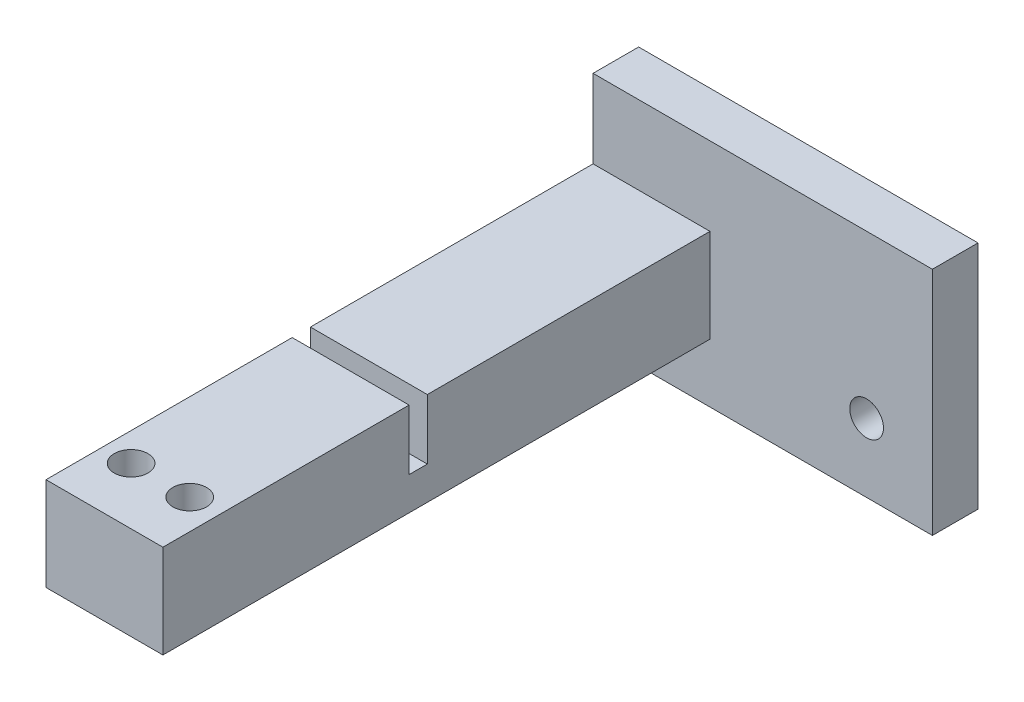
ISO-10303-21;
HEADER;
FILE_DESCRIPTION(('STEP AP214'),'2;1');
FILE_NAME('part.step','',(''),(''),'','','');
FILE_SCHEMA(('AUTOMOTIVE_DESIGN { 1 0 10303 214 1 1 1 1 }'));
ENDSEC;
DATA;
#1=APPLICATION_CONTEXT('core data for automotive mechanical design processes');
#2=APPLICATION_PROTOCOL_DEFINITION('international standard','automotive_design',2000,#1);
#3=PRODUCT_CONTEXT('',#1,'mechanical');
#4=PRODUCT('Part','Part','',(#3));
#5=PRODUCT_RELATED_PRODUCT_CATEGORY('part','',(#4));
#6=PRODUCT_DEFINITION_FORMATION('','',#4);
#7=PRODUCT_DEFINITION_CONTEXT('part definition',#1,'design');
#8=PRODUCT_DEFINITION('design','',#6,#7);
#9=PRODUCT_DEFINITION_SHAPE('','',#8);
#10=(LENGTH_UNIT() NAMED_UNIT(*) SI_UNIT(.MILLI.,.METRE.));
#11=(NAMED_UNIT(*) PLANE_ANGLE_UNIT() SI_UNIT($,.RADIAN.));
#12=(NAMED_UNIT(*) SI_UNIT($,.STERADIAN.) SOLID_ANGLE_UNIT());
#13=UNCERTAINTY_MEASURE_WITH_UNIT(LENGTH_MEASURE(1.E-05),#10,'distance_accuracy_value','');
#14=(GEOMETRIC_REPRESENTATION_CONTEXT(3) GLOBAL_UNCERTAINTY_ASSIGNED_CONTEXT((#13)) GLOBAL_UNIT_ASSIGNED_CONTEXT((#10,
#11,#12)) REPRESENTATION_CONTEXT('',''));
#15=CARTESIAN_POINT('',(0.,0.,0.));
#16=DIRECTION('',(0.,0.,1.));
#17=DIRECTION('',(1.,0.,0.));
#18=AXIS2_PLACEMENT_3D('',#15,#16,#17);
#19=CARTESIAN_POINT('',(-7.63393751811079,-236.230646054278,65.));
#20=DIRECTION('',(0.,-1.,0.));
#21=DIRECTION('',(0.,0.,-1.));
#22=AXIS2_PLACEMENT_3D('',#19,#20,#21);
#23=PLANE('',#22);
#24=CARTESIAN_POINT('',(1.90549840476706,-236.230646054278,58.7782407464542));
#25=DIRECTION('',(0.,1.,0.));
#26=DIRECTION('',(0.,0.,1.));
#27=AXIS2_PLACEMENT_3D('',#24,#25,#26);
#28=CIRCLE('',#27,1.85);
#29=CARTESIAN_POINT('',(1.90549840476706,-236.230646054278,60.6282407464542));
#30=VERTEX_POINT('',#29);
#31=EDGE_CURVE('E216',#30,#30,#28,.T.);
#32=ORIENTED_EDGE('',*,*,#31,.F.);
#33=EDGE_LOOP('',(#32));
#34=FACE_BOUND('',#33,.T.);
#35=CARTESIAN_POINT('',(-4.52306634815614,-236.230646054278,58.7782407464542));
#36=DIRECTION('',(0.,1.,0.));
#37=DIRECTION('',(0.,0.,1.));
#38=AXIS2_PLACEMENT_3D('',#35,#36,#37);
#39=CIRCLE('',#38,1.85);
#40=CARTESIAN_POINT('',(-4.52306634815614,-236.230646054278,60.6282407464542));
#41=VERTEX_POINT('',#40);
#42=EDGE_CURVE('E222',#41,#41,#39,.T.);
#43=ORIENTED_EDGE('',*,*,#42,.F.);
#44=EDGE_LOOP('',(#43));
#45=FACE_BOUND('',#44,.T.);
#46=DIRECTION('',(0.,0.,-1.));
#47=VECTOR('',#46,1.);
#48=CARTESIAN_POINT('',(5.18885462118252,-236.230646054278,65.));
#49=LINE('',#48,#47);
#50=CARTESIAN_POINT('',(5.18885462118252,-236.230646054278,65.));
#51=VERTEX_POINT('',#50);
#52=CARTESIAN_POINT('',(5.18885462118252,-236.230646054278,38.0000000000003));
#53=VERTEX_POINT('',#52);
#54=EDGE_CURVE('E172',#51,#53,#49,.T.);
#55=ORIENTED_EDGE('',*,*,#54,.T.);
#56=DIRECTION('',(-1.,0.,0.));
#57=VECTOR('',#56,1.);
#58=CARTESIAN_POINT('',(-7.63393751811079,-236.230646054278,38.0000000000003));
#59=LINE('',#58,#57);
#60=CARTESIAN_POINT('',(-7.63393751811079,-236.230646054278,38.0000000000003));
#61=VERTEX_POINT('',#60);
#62=EDGE_CURVE('E43',#53,#61,#59,.T.);
#63=ORIENTED_EDGE('',*,*,#62,.T.);
#64=DIRECTION('',(0.,0.,-1.));
#65=VECTOR('',#64,1.);
#66=CARTESIAN_POINT('',(-7.63393751811079,-236.230646054278,65.));
#67=LINE('',#66,#65);
#68=CARTESIAN_POINT('',(-7.63393751811079,-236.230646054278,65.));
#69=VERTEX_POINT('',#68);
#70=EDGE_CURVE('E170',#69,#61,#67,.T.);
#71=ORIENTED_EDGE('',*,*,#70,.F.);
#72=DIRECTION('',(-1.,0.,0.));
#73=VECTOR('',#72,1.);
#74=CARTESIAN_POINT('',(-7.63393751811079,-236.230646054278,65.));
#75=LINE('',#74,#73);
#76=EDGE_CURVE('E161',#51,#69,#75,.T.);
#77=ORIENTED_EDGE('',*,*,#76,.F.);
#78=EDGE_LOOP('',(#55,#63,#71,#77));
#79=FACE_BOUND('',#78,.T.);
#80=ADVANCED_FACE('F34',(#34,#45,#79),#23,.F.);
#81=CARTESIAN_POINT('',(-7.63393751811079,-227.630923277245,5.));
#82=DIRECTION('',(1.,0.,0.));
#83=DIRECTION('',(0.,1.,0.));
#84=AXIS2_PLACEMENT_3D('',#81,#82,#83);
#85=PLANE('',#84);
#86=ORIENTED_EDGE('',*,*,#70,.T.);
#87=DIRECTION('',(0.,1.,0.));
#88=VECTOR('',#87,1.);
#89=CARTESIAN_POINT('',(-7.63393751811079,-236.05692623174,38.0000000000003));
#90=LINE('',#89,#88);
#91=CARTESIAN_POINT('',(-7.63393751811079,-242.835145352554,38.0000000000003));
#92=VERTEX_POINT('',#91);
#93=EDGE_CURVE('E141',#92,#61,#90,.T.);
#94=ORIENTED_EDGE('',*,*,#93,.F.);
#95=DIRECTION('',(0.,0.,1.));
#96=VECTOR('',#95,1.);
#97=CARTESIAN_POINT('',(-7.63393751811079,-242.835145352554,38.0000000000003));
#98=LINE('',#97,#96);
#99=CARTESIAN_POINT('',(-7.63393751811079,-242.835145352554,36.0000000000003));
#100=VERTEX_POINT('',#99);
#101=EDGE_CURVE('E131',#100,#92,#98,.T.);
#102=ORIENTED_EDGE('',*,*,#101,.F.);
#103=DIRECTION('',(0.,-1.,0.));
#104=VECTOR('',#103,1.);
#105=CARTESIAN_POINT('',(-7.63393751811079,-236.05692623174,36.0000000000003));
#106=LINE('',#105,#104);
#107=CARTESIAN_POINT('',(-7.63393751811079,-236.230646054278,36.0000000000003));
#108=VERTEX_POINT('',#107);
#109=EDGE_CURVE('E136',#108,#100,#106,.T.);
#110=ORIENTED_EDGE('',*,*,#109,.F.);
#111=CARTESIAN_POINT('',(-7.63393751811079,-236.230646054278,5.));
#112=VERTEX_POINT('',#111);
#113=EDGE_CURVE('E163',#108,#112,#67,.T.);
#114=ORIENTED_EDGE('',*,*,#113,.T.);
#115=DIRECTION('',(0.,-1.,0.));
#116=VECTOR('',#115,1.);
#117=CARTESIAN_POINT('',(-7.63393751811079,-227.630923277245,5.));
#118=LINE('',#117,#116);
#119=CARTESIAN_POINT('',(-7.63393751811079,-227.630923277245,5.));
#120=VERTEX_POINT('',#119);
#121=EDGE_CURVE('E182',#120,#112,#118,.T.);
#122=ORIENTED_EDGE('',*,*,#121,.F.);
#123=DIRECTION('',(0.,0.,-1.));
#124=VECTOR('',#123,1.);
#125=CARTESIAN_POINT('',(-7.63393751811079,-227.630923277245,5.));
#126=LINE('',#125,#124);
#127=CARTESIAN_POINT('',(-7.63393751811079,-227.630923277245,0.));
#128=VERTEX_POINT('',#127);
#129=EDGE_CURVE('E192',#120,#128,#126,.T.);
#130=ORIENTED_EDGE('',*,*,#129,.T.);
#131=DIRECTION('',(0.,-1.,0.));
#132=VECTOR('',#131,1.);
#133=CARTESIAN_POINT('',(-7.63393751811079,-227.630923277245,0.));
#134=LINE('',#133,#132);
#135=CARTESIAN_POINT('',(-7.63393751811079,-252.920569029994,0.));
#136=VERTEX_POINT('',#135);
#137=EDGE_CURVE('E181',#128,#136,#134,.T.);
#138=ORIENTED_EDGE('',*,*,#137,.T.);
#139=DIRECTION('',(0.,0.,-1.));
#140=VECTOR('',#139,1.);
#141=CARTESIAN_POINT('',(-7.63393751811079,-252.920569029994,5.));
#142=LINE('',#141,#140);
#143=CARTESIAN_POINT('',(-7.63393751811079,-252.920569029994,5.));
#144=VERTEX_POINT('',#143);
#145=EDGE_CURVE('E209',#144,#136,#142,.T.);
#146=ORIENTED_EDGE('',*,*,#145,.F.);
#147=CARTESIAN_POINT('',(-7.63393751811079,-246.472515965401,5.));
#148=VERTEX_POINT('',#147);
#149=EDGE_CURVE('E186',#148,#144,#118,.T.);
#150=ORIENTED_EDGE('',*,*,#149,.F.);
#151=DIRECTION('',(0.,0.,-1.));
#152=VECTOR('',#151,1.);
#153=CARTESIAN_POINT('',(-7.63393751811079,-246.472515965401,65.));
#154=LINE('',#153,#152);
#155=CARTESIAN_POINT('',(-7.63393751811079,-246.472515965401,65.));
#156=VERTEX_POINT('',#155);
#157=EDGE_CURVE('E178',#156,#148,#154,.T.);
#158=ORIENTED_EDGE('',*,*,#157,.F.);
#159=DIRECTION('',(0.,-1.,0.));
#160=VECTOR('',#159,1.);
#161=CARTESIAN_POINT('',(-7.63393751811079,-236.230646054278,65.));
#162=LINE('',#161,#160);
#163=EDGE_CURVE('E153',#69,#156,#162,.T.);
#164=ORIENTED_EDGE('',*,*,#163,.F.);
#165=EDGE_LOOP('',(#86,#94,#102,#110,#114,#122,#130,#138,#146,#150,#158,#164));
#166=FACE_BOUND('',#165,.T.);
#167=ADVANCED_FACE('F36',(#166),#85,.F.);
#168=CARTESIAN_POINT('',(-7.63393751811079,-252.920569029994,5.));
#169=DIRECTION('',(0.,1.,0.));
#170=DIRECTION('',(0.,0.,1.));
#171=AXIS2_PLACEMENT_3D('',#168,#169,#170);
#172=PLANE('',#171);
#173=DIRECTION('',(1.,0.,0.));
#174=VECTOR('',#173,1.);
#175=CARTESIAN_POINT('',(-7.63393751811079,-252.920569029994,0.));
#176=LINE('',#175,#174);
#177=CARTESIAN_POINT('',(29.5856691067899,-252.920569029994,0.));
#178=VERTEX_POINT('',#177);
#179=EDGE_CURVE('E195',#136,#178,#176,.T.);
#180=ORIENTED_EDGE('',*,*,#179,.T.);
#181=DIRECTION('',(0.,0.,-1.));
#182=VECTOR('',#181,1.);
#183=CARTESIAN_POINT('',(29.5856691067899,-252.920569029994,5.));
#184=LINE('',#183,#182);
#185=CARTESIAN_POINT('',(29.5856691067899,-252.920569029994,5.));
#186=VERTEX_POINT('',#185);
#187=EDGE_CURVE('E206',#186,#178,#184,.T.);
#188=ORIENTED_EDGE('',*,*,#187,.F.);
#189=DIRECTION('',(1.,0.,0.));
#190=VECTOR('',#189,1.);
#191=CARTESIAN_POINT('',(-7.63393751811079,-252.920569029994,5.));
#192=LINE('',#191,#190);
#193=EDGE_CURVE('E185',#144,#186,#192,.T.);
#194=ORIENTED_EDGE('',*,*,#193,.F.);
#195=ORIENTED_EDGE('',*,*,#145,.T.);
#196=EDGE_LOOP('',(#180,#188,#194,#195));
#197=FACE_BOUND('',#196,.T.);
#198=ADVANCED_FACE('F277',(#197),#172,.F.);
#199=CARTESIAN_POINT('',(29.5856691067899,-227.630923277245,5.));
#200=DIRECTION('',(-1.,0.,0.));
#201=DIRECTION('',(0.,-1.,0.));
#202=AXIS2_PLACEMENT_3D('',#199,#200,#201);
#203=PLANE('',#202);
#204=DIRECTION('',(0.,1.,0.));
#205=VECTOR('',#204,1.);
#206=CARTESIAN_POINT('',(29.5856691067899,-227.630923277245,0.));
#207=LINE('',#206,#205);
#208=CARTESIAN_POINT('',(29.5856691067899,-227.630923277245,0.));
#209=VERTEX_POINT('',#208);
#210=EDGE_CURVE('E197',#178,#209,#207,.T.);
#211=ORIENTED_EDGE('',*,*,#210,.T.);
#212=DIRECTION('',(0.,0.,-1.));
#213=VECTOR('',#212,1.);
#214=CARTESIAN_POINT('',(29.5856691067899,-227.630923277245,5.));
#215=LINE('',#214,#213);
#216=CARTESIAN_POINT('',(29.5856691067899,-227.630923277245,5.));
#217=VERTEX_POINT('',#216);
#218=EDGE_CURVE('E203',#217,#209,#215,.T.);
#219=ORIENTED_EDGE('',*,*,#218,.F.);
#220=DIRECTION('',(0.,1.,0.));
#221=VECTOR('',#220,1.);
#222=CARTESIAN_POINT('',(29.5856691067899,-227.630923277245,5.));
#223=LINE('',#222,#221);
#224=EDGE_CURVE('E188',#186,#217,#223,.T.);
#225=ORIENTED_EDGE('',*,*,#224,.F.);
#226=ORIENTED_EDGE('',*,*,#187,.T.);
#227=EDGE_LOOP('',(#211,#219,#225,#226));
#228=FACE_BOUND('',#227,.T.);
#229=ADVANCED_FACE('F300',(#228),#203,.F.);
#230=CARTESIAN_POINT('',(-7.63393751811079,-227.630923277245,5.));
#231=DIRECTION('',(0.,-1.,0.));
#232=DIRECTION('',(0.,0.,-1.));
#233=AXIS2_PLACEMENT_3D('',#230,#231,#232);
#234=PLANE('',#233);
#235=DIRECTION('',(-1.,0.,0.));
#236=VECTOR('',#235,1.);
#237=CARTESIAN_POINT('',(-7.63393751811079,-227.630923277245,0.));
#238=LINE('',#237,#236);
#239=EDGE_CURVE('E199',#209,#128,#238,.T.);
#240=ORIENTED_EDGE('',*,*,#239,.T.);
#241=ORIENTED_EDGE('',*,*,#129,.F.);
#242=DIRECTION('',(-1.,0.,0.));
#243=VECTOR('',#242,1.);
#244=CARTESIAN_POINT('',(-7.63393751811079,-227.630923277245,5.));
#245=LINE('',#244,#243);
#246=EDGE_CURVE('E190',#217,#120,#245,.T.);
#247=ORIENTED_EDGE('',*,*,#246,.F.);
#248=ORIENTED_EDGE('',*,*,#218,.T.);
#249=EDGE_LOOP('',(#240,#241,#247,#248));
#250=FACE_BOUND('',#249,.T.);
#251=ADVANCED_FACE('F290',(#250),#234,.F.);
#252=CARTESIAN_POINT('',(0.,0.,5.));
#253=DIRECTION('',(0.,0.,1.));
#254=DIRECTION('',(1.,0.,0.));
#255=AXIS2_PLACEMENT_3D('',#252,#253,#254);
#256=PLANE('',#255);
#257=CARTESIAN_POINT('',(-2.79517748901244,-249.862416258245,5.));
#258=DIRECTION('',(0.,0.,1.));
#259=DIRECTION('',(1.,0.,0.));
#260=AXIS2_PLACEMENT_3D('',#257,#258,#259);
#261=CIRCLE('',#260,1.85);
#262=CARTESIAN_POINT('',(-0.945177489012438,-249.862416258245,5.));
#263=VERTEX_POINT('',#262);
#264=EDGE_CURVE('E229',#263,#263,#261,.T.);
#265=ORIENTED_EDGE('',*,*,#264,.F.);
#266=EDGE_LOOP('',(#265));
#267=FACE_BOUND('',#266,.T.);
#268=CARTESIAN_POINT('',(22.3691525775393,-245.4020720401,5.));
#269=DIRECTION('',(0.,0.,1.));
#270=DIRECTION('',(1.,0.,0.));
#271=AXIS2_PLACEMENT_3D('',#268,#269,#270);
#272=CIRCLE('',#271,1.85);
#273=CARTESIAN_POINT('',(24.2191525775393,-245.4020720401,5.));
#274=VERTEX_POINT('',#273);
#275=EDGE_CURVE('E220',#274,#274,#272,.T.);
#276=ORIENTED_EDGE('',*,*,#275,.F.);
#277=EDGE_LOOP('',(#276));
#278=FACE_BOUND('',#277,.T.);
#279=DIRECTION('',(-1.,0.,0.));
#280=VECTOR('',#279,1.);
#281=CARTESIAN_POINT('',(-7.63393751811079,-236.230646054278,5.));
#282=LINE('',#281,#280);
#283=CARTESIAN_POINT('',(5.18885462118252,-236.230646054278,5.));
#284=VERTEX_POINT('',#283);
#285=EDGE_CURVE('E157',#284,#112,#282,.T.);
#286=ORIENTED_EDGE('',*,*,#285,.F.);
#287=DIRECTION('',(0.,1.,0.));
#288=VECTOR('',#287,1.);
#289=CARTESIAN_POINT('',(5.18885462118252,-236.230646054278,5.));
#290=LINE('',#289,#288);
#291=CARTESIAN_POINT('',(5.18885462118252,-246.472515965401,5.));
#292=VERTEX_POINT('',#291);
#293=EDGE_CURVE('E166',#292,#284,#290,.T.);
#294=ORIENTED_EDGE('',*,*,#293,.F.);
#295=DIRECTION('',(1.,0.,0.));
#296=VECTOR('',#295,1.);
#297=CARTESIAN_POINT('',(-7.63393751811079,-246.472515965401,5.));
#298=LINE('',#297,#296);
#299=EDGE_CURVE('E152',#148,#292,#298,.T.);
#300=ORIENTED_EDGE('',*,*,#299,.F.);
#301=ORIENTED_EDGE('',*,*,#149,.T.);
#302=ORIENTED_EDGE('',*,*,#193,.T.);
#303=ORIENTED_EDGE('',*,*,#224,.T.);
#304=ORIENTED_EDGE('',*,*,#246,.T.);
#305=ORIENTED_EDGE('',*,*,#121,.T.);
#306=EDGE_LOOP('',(#286,#294,#300,#301,#302,#303,#304,#305));
#307=FACE_BOUND('',#306,.T.);
#308=ADVANCED_FACE('F255',(#267,#278,#307),#256,.T.);
#309=CARTESIAN_POINT('',(0.,0.,0.));
#310=DIRECTION('',(0.,0.,1.));
#311=DIRECTION('',(1.,0.,0.));
#312=AXIS2_PLACEMENT_3D('',#309,#310,#311);
#313=PLANE('',#312);
#314=CARTESIAN_POINT('',(-2.79517748901244,-249.862416258245,0.));
#315=DIRECTION('',(0.,0.,1.));
#316=DIRECTION('',(1.,0.,0.));
#317=AXIS2_PLACEMENT_3D('',#314,#315,#316);
#318=CIRCLE('',#317,1.85);
#319=CARTESIAN_POINT('',(-0.945177489012438,-249.862416258245,0.));
#320=VERTEX_POINT('',#319);
#321=EDGE_CURVE('E232',#320,#320,#318,.F.);
#322=ORIENTED_EDGE('',*,*,#321,.F.);
#323=EDGE_LOOP('',(#322));
#324=FACE_BOUND('',#323,.T.);
#325=CARTESIAN_POINT('',(22.3691525775393,-245.4020720401,0.));
#326=DIRECTION('',(0.,0.,1.));
#327=DIRECTION('',(1.,0.,0.));
#328=AXIS2_PLACEMENT_3D('',#325,#326,#327);
#329=CIRCLE('',#328,1.85);
#330=CARTESIAN_POINT('',(24.2191525775393,-245.4020720401,0.));
#331=VERTEX_POINT('',#330);
#332=EDGE_CURVE('E233',#331,#331,#329,.F.);
#333=ORIENTED_EDGE('',*,*,#332,.F.);
#334=EDGE_LOOP('',(#333));
#335=FACE_BOUND('',#334,.T.);
#336=ORIENTED_EDGE('',*,*,#137,.F.);
#337=ORIENTED_EDGE('',*,*,#239,.F.);
#338=ORIENTED_EDGE('',*,*,#210,.F.);
#339=ORIENTED_EDGE('',*,*,#179,.F.);
#340=EDGE_LOOP('',(#336,#337,#338,#339));
#341=FACE_BOUND('',#340,.T.);
#342=ADVANCED_FACE('F259',(#324,#335,#341),#313,.F.);
#343=CARTESIAN_POINT('',(-7.63393751811079,-246.472515965401,65.));
#344=DIRECTION('',(0.,1.,0.));
#345=DIRECTION('',(0.,0.,1.));
#346=AXIS2_PLACEMENT_3D('',#343,#344,#345);
#347=PLANE('',#346);
#348=CARTESIAN_POINT('',(1.90549840476706,-246.472515965401,58.7782407464542));
#349=DIRECTION('',(0.,1.,0.));
#350=DIRECTION('',(0.,0.,1.));
#351=AXIS2_PLACEMENT_3D('',#348,#349,#350);
#352=CIRCLE('',#351,1.85);
#353=CARTESIAN_POINT('',(1.90549840476706,-246.472515965401,60.6282407464542));
#354=VERTEX_POINT('',#353);
#355=EDGE_CURVE('E38',#354,#354,#352,.T.);
#356=ORIENTED_EDGE('',*,*,#355,.T.);
#357=EDGE_LOOP('',(#356));
#358=FACE_BOUND('',#357,.T.);
#359=CARTESIAN_POINT('',(-4.52306634815614,-246.472515965401,58.7782407464542));
#360=DIRECTION('',(0.,1.,0.));
#361=DIRECTION('',(0.,0.,1.));
#362=AXIS2_PLACEMENT_3D('',#359,#360,#361);
#363=CIRCLE('',#362,1.85);
#364=CARTESIAN_POINT('',(-4.52306634815614,-246.472515965401,60.6282407464542));
#365=VERTEX_POINT('',#364);
#366=EDGE_CURVE('E214',#365,#365,#363,.T.);
#367=ORIENTED_EDGE('',*,*,#366,.T.);
#368=EDGE_LOOP('',(#367));
#369=FACE_BOUND('',#368,.T.);
#370=ORIENTED_EDGE('',*,*,#299,.T.);
#371=DIRECTION('',(0.,0.,-1.));
#372=VECTOR('',#371,1.);
#373=CARTESIAN_POINT('',(5.18885462118252,-246.472515965401,65.));
#374=LINE('',#373,#372);
#375=CARTESIAN_POINT('',(5.18885462118252,-246.472515965401,65.));
#376=VERTEX_POINT('',#375);
#377=EDGE_CURVE('E175',#376,#292,#374,.T.);
#378=ORIENTED_EDGE('',*,*,#377,.F.);
#379=DIRECTION('',(1.,0.,0.));
#380=VECTOR('',#379,1.);
#381=CARTESIAN_POINT('',(-7.63393751811079,-246.472515965401,65.));
#382=LINE('',#381,#380);
#383=EDGE_CURVE('E156',#156,#376,#382,.T.);
#384=ORIENTED_EDGE('',*,*,#383,.F.);
#385=ORIENTED_EDGE('',*,*,#157,.T.);
#386=EDGE_LOOP('',(#370,#378,#384,#385));
#387=FACE_BOUND('',#386,.T.);
#388=ADVANCED_FACE('F257',(#358,#369,#387),#347,.F.);
#389=CARTESIAN_POINT('',(5.18885462118252,-236.230646054278,65.));
#390=DIRECTION('',(-1.,0.,0.));
#391=DIRECTION('',(0.,0.,1.));
#392=AXIS2_PLACEMENT_3D('',#389,#390,#391);
#393=PLANE('',#392);
#394=DIRECTION('',(0.,0.,1.));
#395=VECTOR('',#394,1.);
#396=CARTESIAN_POINT('',(5.18885462118252,-242.835145352554,65.));
#397=LINE('',#396,#395);
#398=CARTESIAN_POINT('',(5.18885462118252,-242.835145352554,36.0000000000003));
#399=VERTEX_POINT('',#398);
#400=CARTESIAN_POINT('',(5.18885462118252,-242.835145352554,38.0000000000003));
#401=VERTEX_POINT('',#400);
#402=EDGE_CURVE('E11',#399,#401,#397,.T.);
#403=ORIENTED_EDGE('',*,*,#402,.T.);
#404=DIRECTION('',(0.,1.,0.));
#405=VECTOR('',#404,1.);
#406=CARTESIAN_POINT('',(5.18885462118252,-236.230646054278,38.0000000000003));
#407=LINE('',#406,#405);
#408=EDGE_CURVE('E149',#401,#53,#407,.T.);
#409=ORIENTED_EDGE('',*,*,#408,.T.);
#410=ORIENTED_EDGE('',*,*,#54,.F.);
#411=DIRECTION('',(0.,1.,0.));
#412=VECTOR('',#411,1.);
#413=CARTESIAN_POINT('',(5.18885462118252,-236.230646054278,65.));
#414=LINE('',#413,#412);
#415=EDGE_CURVE('E159',#376,#51,#414,.T.);
#416=ORIENTED_EDGE('',*,*,#415,.F.);
#417=ORIENTED_EDGE('',*,*,#377,.T.);
#418=ORIENTED_EDGE('',*,*,#293,.T.);
#419=CARTESIAN_POINT('',(5.18885462118252,-236.230646054278,36.0000000000003));
#420=VERTEX_POINT('',#419);
#421=EDGE_CURVE('E58',#420,#284,#49,.T.);
#422=ORIENTED_EDGE('',*,*,#421,.F.);
#423=DIRECTION('',(0.,-1.,0.));
#424=VECTOR('',#423,1.);
#425=CARTESIAN_POINT('',(5.18885462118252,-236.230646054278,36.0000000000003));
#426=LINE('',#425,#424);
#427=EDGE_CURVE('E51',#420,#399,#426,.T.);
#428=ORIENTED_EDGE('',*,*,#427,.T.);
#429=EDGE_LOOP('',(#403,#409,#410,#416,#417,#418,#422,#428));
#430=FACE_BOUND('',#429,.T.);
#431=ADVANCED_FACE('F253',(#430),#393,.F.);
#432=ORIENTED_EDGE('',*,*,#113,.F.);
#433=DIRECTION('',(1.,0.,0.));
#434=VECTOR('',#433,1.);
#435=CARTESIAN_POINT('',(-7.63393751811079,-236.230646054278,36.0000000000003));
#436=LINE('',#435,#434);
#437=EDGE_CURVE('E138',#108,#420,#436,.T.);
#438=ORIENTED_EDGE('',*,*,#437,.T.);
#439=ORIENTED_EDGE('',*,*,#421,.T.);
#440=ORIENTED_EDGE('',*,*,#285,.T.);
#441=EDGE_LOOP('',(#432,#438,#439,#440));
#442=FACE_BOUND('',#441,.T.);
#443=ADVANCED_FACE('F266',(#442),#23,.F.);
#444=CARTESIAN_POINT('',(0.,0.,65.));
#445=DIRECTION('',(0.,0.,1.));
#446=DIRECTION('',(1.,0.,0.));
#447=AXIS2_PLACEMENT_3D('',#444,#445,#446);
#448=PLANE('',#447);
#449=ORIENTED_EDGE('',*,*,#163,.T.);
#450=ORIENTED_EDGE('',*,*,#383,.T.);
#451=ORIENTED_EDGE('',*,*,#415,.T.);
#452=ORIENTED_EDGE('',*,*,#76,.T.);
#453=EDGE_LOOP('',(#449,#450,#451,#452));
#454=FACE_BOUND('',#453,.T.);
#455=ADVANCED_FACE('F249',(#454),#448,.T.);
#456=CARTESIAN_POINT('',(52.3660624818892,-242.835145352554,38.0000000000003));
#457=DIRECTION('',(0.,-1.,0.));
#458=DIRECTION('',(1.,0.,0.));
#459=AXIS2_PLACEMENT_3D('',#456,#457,#458);
#460=PLANE('',#459);
#461=DIRECTION('',(-1.,0.,0.));
#462=VECTOR('',#461,1.);
#463=CARTESIAN_POINT('',(52.3660624818892,-242.835145352554,36.0000000000003));
#464=LINE('',#463,#462);
#465=EDGE_CURVE('E126',#399,#100,#464,.T.);
#466=ORIENTED_EDGE('',*,*,#465,.T.);
#467=ORIENTED_EDGE('',*,*,#101,.T.);
#468=DIRECTION('',(-1.,0.,0.));
#469=VECTOR('',#468,1.);
#470=CARTESIAN_POINT('',(52.3660624818892,-242.835145352554,38.0000000000003));
#471=LINE('',#470,#469);
#472=EDGE_CURVE('E133',#401,#92,#471,.T.);
#473=ORIENTED_EDGE('',*,*,#472,.F.);
#474=ORIENTED_EDGE('',*,*,#402,.F.);
#475=EDGE_LOOP('',(#466,#467,#473,#474));
#476=FACE_BOUND('',#475,.T.);
#477=ADVANCED_FACE('F128',(#476),#460,.F.);
#478=CARTESIAN_POINT('',(52.3660624818892,-236.05692623174,38.0000000000003));
#479=DIRECTION('',(0.,0.,1.));
#480=DIRECTION('',(1.,0.,0.));
#481=AXIS2_PLACEMENT_3D('',#478,#479,#480);
#482=PLANE('',#481);
#483=ORIENTED_EDGE('',*,*,#472,.T.);
#484=ORIENTED_EDGE('',*,*,#93,.T.);
#485=ORIENTED_EDGE('',*,*,#62,.F.);
#486=ORIENTED_EDGE('',*,*,#408,.F.);
#487=EDGE_LOOP('',(#483,#484,#485,#486));
#488=FACE_BOUND('',#487,.T.);
#489=ADVANCED_FACE('F240',(#488),#482,.F.);
#490=CARTESIAN_POINT('',(52.3660624818892,-236.05692623174,36.0000000000003));
#491=DIRECTION('',(0.,0.,-1.));
#492=DIRECTION('',(-1.,0.,0.));
#493=AXIS2_PLACEMENT_3D('',#490,#491,#492);
#494=PLANE('',#493);
#495=ORIENTED_EDGE('',*,*,#437,.F.);
#496=ORIENTED_EDGE('',*,*,#109,.T.);
#497=ORIENTED_EDGE('',*,*,#465,.F.);
#498=ORIENTED_EDGE('',*,*,#427,.F.);
#499=EDGE_LOOP('',(#495,#496,#497,#498));
#500=FACE_BOUND('',#499,.T.);
#501=ADVANCED_FACE('F137',(#500),#494,.F.);
#502=CARTESIAN_POINT('',(22.3691525775393,-245.4020720401,-5.23259018078043));
#503=DIRECTION('',(0.,0.,1.));
#504=DIRECTION('',(1.,0.,0.));
#505=AXIS2_PLACEMENT_3D('',#502,#503,#504);
#506=CYLINDRICAL_SURFACE('',#505,1.85);
#507=ORIENTED_EDGE('',*,*,#332,.T.);
#508=EDGE_LOOP('',(#507));
#509=FACE_BOUND('',#508,.T.);
#510=ORIENTED_EDGE('',*,*,#275,.T.);
#511=EDGE_LOOP('',(#510));
#512=FACE_BOUND('',#511,.T.);
#513=ADVANCED_FACE('F316',(#509,#512),#506,.F.);
#514=CARTESIAN_POINT('',(-2.79517748901244,-249.862416258245,-5.23259018078043));
#515=DIRECTION('',(0.,0.,1.));
#516=DIRECTION('',(1.,0.,0.));
#517=AXIS2_PLACEMENT_3D('',#514,#515,#516);
#518=CYLINDRICAL_SURFACE('',#517,1.85);
#519=ORIENTED_EDGE('',*,*,#321,.T.);
#520=EDGE_LOOP('',(#519));
#521=FACE_BOUND('',#520,.T.);
#522=ORIENTED_EDGE('',*,*,#264,.T.);
#523=EDGE_LOOP('',(#522));
#524=FACE_BOUND('',#523,.T.);
#525=ADVANCED_FACE('F318',(#521,#524),#518,.F.);
#526=CARTESIAN_POINT('',(-4.52306634815614,-252.920569029994,58.7782407464542));
#527=DIRECTION('',(0.,1.,0.));
#528=DIRECTION('',(0.,0.,1.));
#529=AXIS2_PLACEMENT_3D('',#526,#527,#528);
#530=CYLINDRICAL_SURFACE('',#529,1.85);
#531=ORIENTED_EDGE('',*,*,#42,.T.);
#532=EDGE_LOOP('',(#531));
#533=FACE_BOUND('',#532,.T.);
#534=ORIENTED_EDGE('',*,*,#366,.F.);
#535=EDGE_LOOP('',(#534));
#536=FACE_BOUND('',#535,.T.);
#537=ADVANCED_FACE('F325',(#533,#536),#530,.F.);
#538=CARTESIAN_POINT('',(1.90549840476706,-252.920569029994,58.7782407464542));
#539=DIRECTION('',(0.,1.,0.));
#540=DIRECTION('',(0.,0.,1.));
#541=AXIS2_PLACEMENT_3D('',#538,#539,#540);
#542=CYLINDRICAL_SURFACE('',#541,1.85);
#543=ORIENTED_EDGE('',*,*,#31,.T.);
#544=EDGE_LOOP('',(#543));
#545=FACE_BOUND('',#544,.T.);
#546=ORIENTED_EDGE('',*,*,#355,.F.);
#547=EDGE_LOOP('',(#546));
#548=FACE_BOUND('',#547,.T.);
#549=ADVANCED_FACE('F384',(#545,#548),#542,.F.);
#550=CLOSED_SHELL('',(#80,#167,#198,#229,#251,#308,#342,#388,#431,#443,#455,#477,#489,#501,#513,
#525,#537,#549));
#551=MANIFOLD_SOLID_BREP('B2',#550);
#552=ADVANCED_BREP_SHAPE_REPRESENTATION('',(#18,#551),#14);
#553=SHAPE_DEFINITION_REPRESENTATION(#9,#552);
ENDSEC;
END-ISO-10303-21;
